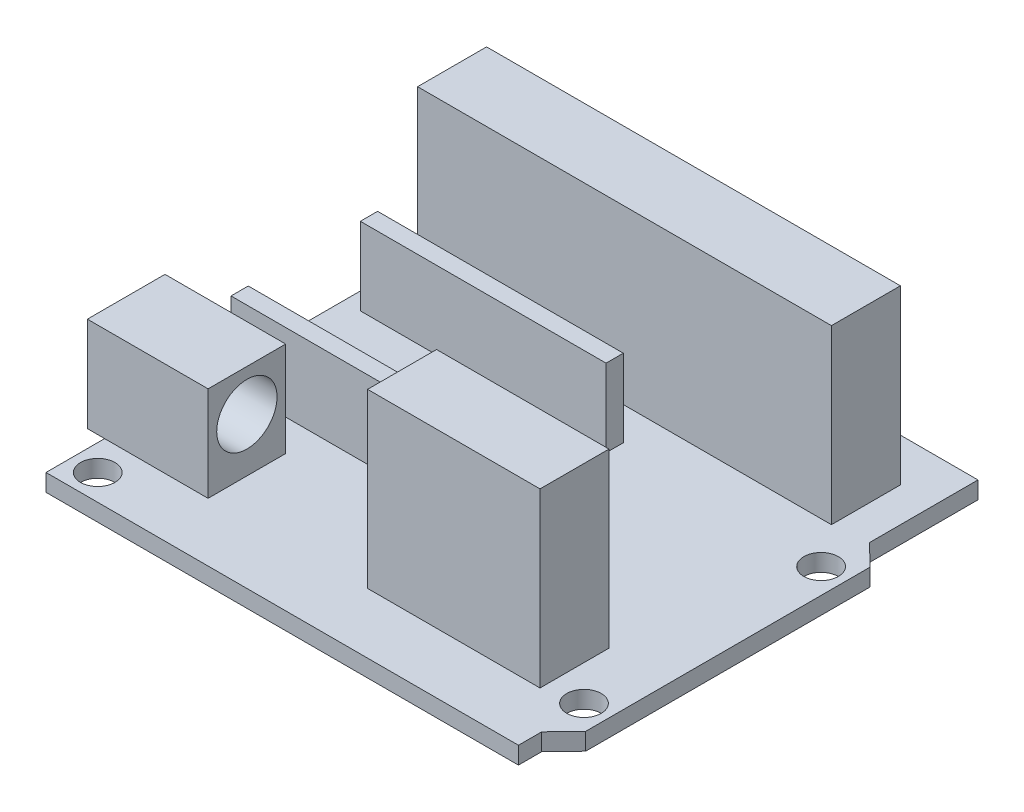
ISO-10303-21;
HEADER;
FILE_DESCRIPTION(('STEP AP214'),'2;1');
FILE_NAME('part.step','',(''),(''),'','','');
FILE_SCHEMA(('AUTOMOTIVE_DESIGN { 1 0 10303 214 1 1 1 1 }'));
ENDSEC;
DATA;
#1=APPLICATION_CONTEXT('core data for automotive mechanical design processes');
#2=APPLICATION_PROTOCOL_DEFINITION('international standard','automotive_design',2000,#1);
#3=PRODUCT_CONTEXT('',#1,'mechanical');
#4=PRODUCT('Part','Part','',(#3));
#5=PRODUCT_RELATED_PRODUCT_CATEGORY('part','',(#4));
#6=PRODUCT_DEFINITION_FORMATION('','',#4);
#7=PRODUCT_DEFINITION_CONTEXT('part definition',#1,'design');
#8=PRODUCT_DEFINITION('design','',#6,#7);
#9=PRODUCT_DEFINITION_SHAPE('','',#8);
#10=(LENGTH_UNIT() NAMED_UNIT(*) SI_UNIT(.MILLI.,.METRE.));
#11=(NAMED_UNIT(*) PLANE_ANGLE_UNIT() SI_UNIT($,.RADIAN.));
#12=(NAMED_UNIT(*) SI_UNIT($,.STERADIAN.) SOLID_ANGLE_UNIT());
#13=UNCERTAINTY_MEASURE_WITH_UNIT(LENGTH_MEASURE(1.E-05),#10,'distance_accuracy_value','');
#14=(GEOMETRIC_REPRESENTATION_CONTEXT(3) GLOBAL_UNCERTAINTY_ASSIGNED_CONTEXT((#13)) GLOBAL_UNIT_ASSIGNED_CONTEXT((#10,
#11,#12)) REPRESENTATION_CONTEXT('',''));
#15=CARTESIAN_POINT('',(0.,0.,0.));
#16=DIRECTION('',(0.,0.,1.));
#17=DIRECTION('',(1.,0.,0.));
#18=AXIS2_PLACEMENT_3D('',#15,#16,#17);
#19=CARTESIAN_POINT('',(0.,2.,0.));
#20=DIRECTION('',(0.,1.,0.));
#21=DIRECTION('',(0.,0.,1.));
#22=AXIS2_PLACEMENT_3D('',#19,#20,#21);
#23=PLANE('',#22);
#24=DIRECTION('',(-1.,0.,0.));
#25=VECTOR('',#24,1.);
#26=CARTESIAN_POINT('',(12.,2.,-6.8));
#27=LINE('',#26,#25);
#28=CARTESIAN_POINT('',(12.,2.,-6.8));
#29=VERTEX_POINT('',#28);
#30=CARTESIAN_POINT('',(0.,2.,-6.8));
#31=VERTEX_POINT('',#30);
#32=EDGE_CURVE('E251',#29,#31,#27,.T.);
#33=ORIENTED_EDGE('',*,*,#32,.T.);
#34=DIRECTION('',(0.,0.,-1.));
#35=VECTOR('',#34,1.);
#36=CARTESIAN_POINT('',(0.,2.,0.));
#37=LINE('',#36,#35);
#38=CARTESIAN_POINT('',(0.,2.,0.));
#39=VERTEX_POINT('',#38);
#40=EDGE_CURVE('E415',#39,#31,#37,.T.);
#41=ORIENTED_EDGE('',*,*,#40,.F.);
#42=DIRECTION('',(1.,0.,0.));
#43=VECTOR('',#42,1.);
#44=CARTESIAN_POINT('',(0.,2.,0.));
#45=LINE('',#44,#43);
#46=CARTESIAN_POINT('',(54.8,2.,0.));
#47=VERTEX_POINT('',#46);
#48=EDGE_CURVE('E418',#39,#47,#45,.T.);
#49=ORIENTED_EDGE('',*,*,#48,.T.);
#50=DIRECTION('',(0.,0.,-1.));
#51=VECTOR('',#50,1.);
#52=CARTESIAN_POINT('',(54.8,2.,2.8210303747817E-13));
#53=LINE('',#52,#51);
#54=CARTESIAN_POINT('',(54.8,2.,-2.69583333333333));
#55=VERTEX_POINT('',#54);
#56=EDGE_CURVE('E422',#47,#55,#53,.T.);
#57=ORIENTED_EDGE('',*,*,#56,.T.);
#58=DIRECTION('',(0.692531828189704,0.,-0.72138732103096));
#59=VECTOR('',#58,1.);
#60=CARTESIAN_POINT('',(27.171107410492,2.,26.0842631140716));
#61=LINE('',#60,#59);
#62=CARTESIAN_POINT('',(57.3,2.,-5.30000000000005));
#63=VERTEX_POINT('',#62);
#64=EDGE_CURVE('E425',#55,#63,#61,.T.);
#65=ORIENTED_EDGE('',*,*,#64,.T.);
#66=DIRECTION('',(0.,0.,1.));
#67=VECTOR('',#66,1.);
#68=CARTESIAN_POINT('',(57.3,2.,0.));
#69=LINE('',#68,#67);
#70=CARTESIAN_POINT('',(57.3,2.,-38.3));
#71=VERTEX_POINT('',#70);
#72=EDGE_CURVE('E402',#71,#63,#69,.T.);
#73=ORIENTED_EDGE('',*,*,#72,.F.);
#74=DIRECTION('',(0.72138732103096,0.,0.692531828189705));
#75=VECTOR('',#74,1.);
#76=CARTESIAN_POINT('',(46.6151540383007,2.,-48.5574521232311));
#77=LINE('',#76,#75);
#78=CARTESIAN_POINT('',(54.8,2.,-40.7));
#79=VERTEX_POINT('',#78);
#80=EDGE_CURVE('E405',#79,#71,#77,.T.);
#81=ORIENTED_EDGE('',*,*,#80,.F.);
#82=DIRECTION('',(0.,0.,1.));
#83=VECTOR('',#82,1.);
#84=CARTESIAN_POINT('',(54.8,2.,0.));
#85=LINE('',#84,#83);
#86=CARTESIAN_POINT('',(54.8,2.,-53.3));
#87=VERTEX_POINT('',#86);
#88=EDGE_CURVE('E408',#87,#79,#85,.T.);
#89=ORIENTED_EDGE('',*,*,#88,.F.);
#90=DIRECTION('',(1.,0.,0.));
#91=VECTOR('',#90,1.);
#92=CARTESIAN_POINT('',(0.,2.,-53.3));
#93=LINE('',#92,#91);
#94=CARTESIAN_POINT('',(0.,2.,-53.3));
#95=VERTEX_POINT('',#94);
#96=EDGE_CURVE('E411',#95,#87,#93,.T.);
#97=ORIENTED_EDGE('',*,*,#96,.F.);
#98=CARTESIAN_POINT('',(0.,2.,-15.8));
#99=VERTEX_POINT('',#98);
#100=EDGE_CURVE('E414',#99,#95,#37,.T.);
#101=ORIENTED_EDGE('',*,*,#100,.F.);
#102=DIRECTION('',(-1.,0.,0.));
#103=VECTOR('',#102,1.);
#104=CARTESIAN_POINT('',(12.,2.,-15.8));
#105=LINE('',#104,#103);
#106=CARTESIAN_POINT('',(12.,2.,-15.8));
#107=VERTEX_POINT('',#106);
#108=EDGE_CURVE('E50',#107,#99,#105,.T.);
#109=ORIENTED_EDGE('',*,*,#108,.F.);
#110=DIRECTION('',(0.,0.,1.));
#111=VECTOR('',#110,1.);
#112=CARTESIAN_POINT('',(12.,2.,-6.8));
#113=LINE('',#112,#111);
#114=EDGE_CURVE('E237',#107,#29,#113,.T.);
#115=ORIENTED_EDGE('',*,*,#114,.T.);
#116=EDGE_LOOP('',(#33,#41,#49,#57,#65,#73,#81,#89,#97,#101,#109,#115));
#117=FACE_BOUND('',#116,.T.);
#118=CARTESIAN_POINT('',(54.4,2.,-35.5));
#119=DIRECTION('',(0.,1.,0.));
#120=DIRECTION('',(0.,0.,1.));
#121=AXIS2_PLACEMENT_3D('',#118,#119,#120);
#122=CIRCLE('',#121,2.);
#123=CARTESIAN_POINT('',(54.4,2.,-33.5));
#124=VERTEX_POINT('',#123);
#125=EDGE_CURVE('E389',#124,#124,#122,.T.);
#126=ORIENTED_EDGE('',*,*,#125,.F.);
#127=EDGE_LOOP('',(#126));
#128=FACE_BOUND('',#127,.T.);
#129=CARTESIAN_POINT('',(54.4,2.,-8.));
#130=DIRECTION('',(0.,1.,0.));
#131=DIRECTION('',(0.,0.,1.));
#132=AXIS2_PLACEMENT_3D('',#129,#130,#131);
#133=CIRCLE('',#132,2.);
#134=CARTESIAN_POINT('',(54.4,2.,-6.));
#135=VERTEX_POINT('',#134);
#136=EDGE_CURVE('E392',#135,#135,#133,.T.);
#137=ORIENTED_EDGE('',*,*,#136,.F.);
#138=EDGE_LOOP('',(#137));
#139=FACE_BOUND('',#138,.T.);
#140=CARTESIAN_POINT('',(4.,2.,-50.8));
#141=DIRECTION('',(0.,1.,0.));
#142=DIRECTION('',(0.,0.,1.));
#143=AXIS2_PLACEMENT_3D('',#140,#141,#142);
#144=CIRCLE('',#143,2.);
#145=CARTESIAN_POINT('',(4.,2.,-48.8));
#146=VERTEX_POINT('',#145);
#147=EDGE_CURVE('E396',#146,#146,#144,.T.);
#148=ORIENTED_EDGE('',*,*,#147,.F.);
#149=EDGE_LOOP('',(#148));
#150=FACE_BOUND('',#149,.T.);
#151=CARTESIAN_POINT('',(3.,2.,-3.));
#152=DIRECTION('',(0.,1.,0.));
#153=DIRECTION('',(0.,0.,1.));
#154=AXIS2_PLACEMENT_3D('',#151,#152,#153);
#155=CIRCLE('',#154,2.);
#156=CARTESIAN_POINT('',(3.,2.,-1.));
#157=VERTEX_POINT('',#156);
#158=EDGE_CURVE('E399',#157,#157,#155,.T.);
#159=ORIENTED_EDGE('',*,*,#158,.F.);
#160=EDGE_LOOP('',(#159));
#161=FACE_BOUND('',#160,.T.);
#162=DIRECTION('',(1.,0.,0.));
#163=VECTOR('',#162,1.);
#164=CARTESIAN_POINT('',(2.,2.,-34.4601858981801));
#165=LINE('',#164,#163);
#166=CARTESIAN_POINT('',(2.,2.,-34.4601858981801));
#167=VERTEX_POINT('',#166);
#168=CARTESIAN_POINT('',(30.5,2.,-34.4601858981801));
#169=VERTEX_POINT('',#168);
#170=EDGE_CURVE('E373',#167,#169,#165,.T.);
#171=ORIENTED_EDGE('',*,*,#170,.F.);
#172=DIRECTION('',(0.,0.,1.));
#173=VECTOR('',#172,1.);
#174=CARTESIAN_POINT('',(2.,2.,-36.4601858981801));
#175=LINE('',#174,#173);
#176=CARTESIAN_POINT('',(2.,2.,-36.4601858981801));
#177=VERTEX_POINT('',#176);
#178=EDGE_CURVE('E359',#177,#167,#175,.T.);
#179=ORIENTED_EDGE('',*,*,#178,.F.);
#180=DIRECTION('',(-1.,0.,0.));
#181=VECTOR('',#180,1.);
#182=CARTESIAN_POINT('',(2.,2.,-36.4601858981801));
#183=LINE('',#182,#181);
#184=CARTESIAN_POINT('',(30.5,2.,-36.4601858981801));
#185=VERTEX_POINT('',#184);
#186=EDGE_CURVE('E364',#185,#177,#183,.T.);
#187=ORIENTED_EDGE('',*,*,#186,.F.);
#188=DIRECTION('',(0.,0.,-1.));
#189=VECTOR('',#188,1.);
#190=CARTESIAN_POINT('',(30.5,2.,-36.4601858981801));
#191=LINE('',#190,#189);
#192=EDGE_CURVE('E375',#169,#185,#191,.T.);
#193=ORIENTED_EDGE('',*,*,#192,.F.);
#194=EDGE_LOOP('',(#171,#179,#187,#193));
#195=FACE_BOUND('',#194,.T.);
#196=DIRECTION('',(1.,0.,0.));
#197=VECTOR('',#196,1.);
#198=CARTESIAN_POINT('',(2.,2.,-19.4601858981801));
#199=LINE('',#198,#197);
#200=CARTESIAN_POINT('',(2.,2.,-19.4601858981801));
#201=VERTEX_POINT('',#200);
#202=CARTESIAN_POINT('',(30.5,2.,-19.4601858981801));
#203=VERTEX_POINT('',#202);
#204=EDGE_CURVE('E344',#201,#203,#199,.T.);
#205=ORIENTED_EDGE('',*,*,#204,.F.);
#206=DIRECTION('',(0.,0.,1.));
#207=VECTOR('',#206,1.);
#208=CARTESIAN_POINT('',(2.,2.,-21.4601858981801));
#209=LINE('',#208,#207);
#210=CARTESIAN_POINT('',(2.,2.,-21.4601858981801));
#211=VERTEX_POINT('',#210);
#212=EDGE_CURVE('E330',#211,#201,#209,.T.);
#213=ORIENTED_EDGE('',*,*,#212,.F.);
#214=DIRECTION('',(-1.,0.,0.));
#215=VECTOR('',#214,1.);
#216=CARTESIAN_POINT('',(2.,2.,-21.4601858981801));
#217=LINE('',#216,#215);
#218=CARTESIAN_POINT('',(30.5,2.,-21.4601858981801));
#219=VERTEX_POINT('',#218);
#220=EDGE_CURVE('E335',#219,#211,#217,.T.);
#221=ORIENTED_EDGE('',*,*,#220,.F.);
#222=DIRECTION('',(0.,0.,-1.));
#223=VECTOR('',#222,1.);
#224=CARTESIAN_POINT('',(30.5,2.,-21.4601858981801));
#225=LINE('',#224,#223);
#226=EDGE_CURVE('E346',#203,#219,#225,.T.);
#227=ORIENTED_EDGE('',*,*,#226,.F.);
#228=EDGE_LOOP('',(#205,#213,#221,#227));
#229=FACE_BOUND('',#228,.T.);
#230=DIRECTION('',(-1.,0.,0.));
#231=VECTOR('',#230,1.);
#232=CARTESIAN_POINT('',(50.3,2.,-15.));
#233=LINE('',#232,#231);
#234=CARTESIAN_POINT('',(50.3,2.,-15.));
#235=VERTEX_POINT('',#234);
#236=CARTESIAN_POINT('',(30.3,2.,-15.));
#237=VERTEX_POINT('',#236);
#238=EDGE_CURVE('E315',#235,#237,#233,.T.);
#239=ORIENTED_EDGE('',*,*,#238,.F.);
#240=DIRECTION('',(0.,0.,-1.));
#241=VECTOR('',#240,1.);
#242=CARTESIAN_POINT('',(50.3,2.,-7.));
#243=LINE('',#242,#241);
#244=CARTESIAN_POINT('',(50.3,2.,-7.));
#245=VERTEX_POINT('',#244);
#246=EDGE_CURVE('E301',#245,#235,#243,.T.);
#247=ORIENTED_EDGE('',*,*,#246,.F.);
#248=DIRECTION('',(1.,0.,0.));
#249=VECTOR('',#248,1.);
#250=CARTESIAN_POINT('',(50.3,2.,-7.));
#251=LINE('',#250,#249);
#252=CARTESIAN_POINT('',(30.3,2.,-7.));
#253=VERTEX_POINT('',#252);
#254=EDGE_CURVE('E306',#253,#245,#251,.T.);
#255=ORIENTED_EDGE('',*,*,#254,.F.);
#256=DIRECTION('',(0.,0.,1.));
#257=VECTOR('',#256,1.);
#258=CARTESIAN_POINT('',(30.3,2.,-7.));
#259=LINE('',#258,#257);
#260=EDGE_CURVE('E317',#237,#253,#259,.T.);
#261=ORIENTED_EDGE('',*,*,#260,.F.);
#262=EDGE_LOOP('',(#239,#247,#255,#261));
#263=FACE_BOUND('',#262,.T.);
#264=DIRECTION('',(-1.,0.,0.));
#265=VECTOR('',#264,1.);
#266=CARTESIAN_POINT('',(50.8,2.,-48.3));
#267=LINE('',#266,#265);
#268=CARTESIAN_POINT('',(50.8,2.,-48.3));
#269=VERTEX_POINT('',#268);
#270=CARTESIAN_POINT('',(2.8,2.,-48.3));
#271=VERTEX_POINT('',#270);
#272=EDGE_CURVE('E288',#269,#271,#267,.T.);
#273=ORIENTED_EDGE('',*,*,#272,.F.);
#274=DIRECTION('',(0.,0.,-1.));
#275=VECTOR('',#274,1.);
#276=CARTESIAN_POINT('',(50.8,2.,-48.3));
#277=LINE('',#276,#275);
#278=CARTESIAN_POINT('',(50.8,2.,-40.3));
#279=VERTEX_POINT('',#278);
#280=EDGE_CURVE('E270',#279,#269,#277,.T.);
#281=ORIENTED_EDGE('',*,*,#280,.F.);
#282=DIRECTION('',(1.,0.,0.));
#283=VECTOR('',#282,1.);
#284=CARTESIAN_POINT('',(50.8,2.,-40.3));
#285=LINE('',#284,#283);
#286=CARTESIAN_POINT('',(2.8,2.,-40.3));
#287=VERTEX_POINT('',#286);
#288=EDGE_CURVE('E279',#287,#279,#285,.T.);
#289=ORIENTED_EDGE('',*,*,#288,.F.);
#290=DIRECTION('',(0.,0.,1.));
#291=VECTOR('',#290,1.);
#292=CARTESIAN_POINT('',(2.8,2.,-48.3));
#293=LINE('',#292,#291);
#294=EDGE_CURVE('E290',#271,#287,#293,.T.);
#295=ORIENTED_EDGE('',*,*,#294,.F.);
#296=EDGE_LOOP('',(#273,#281,#289,#295));
#297=FACE_BOUND('',#296,.T.);
#298=ADVANCED_FACE('F35',(#117,#128,#139,#150,#161,#195,#229,#263,#297),#23,.T.);
#299=CARTESIAN_POINT('',(57.3,2.,0.));
#300=DIRECTION('',(1.,0.,0.));
#301=DIRECTION('',(0.,0.,-1.));
#302=AXIS2_PLACEMENT_3D('',#299,#300,#301);
#303=PLANE('',#302);
#304=DIRECTION('',(0.,0.,1.));
#305=VECTOR('',#304,1.);
#306=CARTESIAN_POINT('',(57.3,0.,0.));
#307=LINE('',#306,#305);
#308=CARTESIAN_POINT('',(57.3,0.,-38.3));
#309=VERTEX_POINT('',#308);
#310=CARTESIAN_POINT('',(57.3,0.,-5.30000000000005));
#311=VERTEX_POINT('',#310);
#312=EDGE_CURVE('E439',#309,#311,#307,.T.);
#313=ORIENTED_EDGE('',*,*,#312,.F.);
#314=DIRECTION('',(0.,-1.,0.));
#315=VECTOR('',#314,1.);
#316=CARTESIAN_POINT('',(57.3,2.,-38.3));
#317=LINE('',#316,#315);
#318=EDGE_CURVE('E11',#71,#309,#317,.T.);
#319=ORIENTED_EDGE('',*,*,#318,.F.);
#320=ORIENTED_EDGE('',*,*,#72,.T.);
#321=DIRECTION('',(0.,-1.,0.));
#322=VECTOR('',#321,1.);
#323=CARTESIAN_POINT('',(57.3,2.,-5.30000000000005));
#324=LINE('',#323,#322);
#325=EDGE_CURVE('E427',#63,#311,#324,.T.);
#326=ORIENTED_EDGE('',*,*,#325,.T.);
#327=EDGE_LOOP('',(#313,#319,#320,#326));
#328=FACE_BOUND('',#327,.T.);
#329=ADVANCED_FACE('F498',(#328),#303,.T.);
#330=CARTESIAN_POINT('',(46.6151540383007,2.,-48.5574521232311));
#331=DIRECTION('',(0.692531828189705,0.,-0.72138732103096));
#332=DIRECTION('',(-0.72138732103096,0.,-0.692531828189705));
#333=AXIS2_PLACEMENT_3D('',#330,#331,#332);
#334=PLANE('',#333);
#335=DIRECTION('',(0.72138732103096,0.,0.692531828189705));
#336=VECTOR('',#335,1.);
#337=CARTESIAN_POINT('',(46.6151540383007,0.,-48.5574521232311));
#338=LINE('',#337,#336);
#339=CARTESIAN_POINT('',(54.8,0.,-40.7));
#340=VERTEX_POINT('',#339);
#341=EDGE_CURVE('E442',#340,#309,#338,.T.);
#342=ORIENTED_EDGE('',*,*,#341,.F.);
#343=DIRECTION('',(0.,-1.,0.));
#344=VECTOR('',#343,1.);
#345=CARTESIAN_POINT('',(54.8,2.,-40.7));
#346=LINE('',#345,#344);
#347=EDGE_CURVE('E43',#79,#340,#346,.T.);
#348=ORIENTED_EDGE('',*,*,#347,.F.);
#349=ORIENTED_EDGE('',*,*,#80,.T.);
#350=ORIENTED_EDGE('',*,*,#318,.T.);
#351=EDGE_LOOP('',(#342,#348,#349,#350));
#352=FACE_BOUND('',#351,.T.);
#353=ADVANCED_FACE('F481',(#352),#334,.T.);
#354=CARTESIAN_POINT('',(54.8,2.,0.));
#355=DIRECTION('',(1.,0.,0.));
#356=DIRECTION('',(0.,0.,-1.));
#357=AXIS2_PLACEMENT_3D('',#354,#355,#356);
#358=PLANE('',#357);
#359=DIRECTION('',(0.,0.,1.));
#360=VECTOR('',#359,1.);
#361=CARTESIAN_POINT('',(54.8,0.,0.));
#362=LINE('',#361,#360);
#363=CARTESIAN_POINT('',(54.8,0.,-53.3));
#364=VERTEX_POINT('',#363);
#365=EDGE_CURVE('E445',#364,#340,#362,.T.);
#366=ORIENTED_EDGE('',*,*,#365,.F.);
#367=DIRECTION('',(0.,-1.,0.));
#368=VECTOR('',#367,1.);
#369=CARTESIAN_POINT('',(54.8,2.,-53.3));
#370=LINE('',#369,#368);
#371=EDGE_CURVE('E473',#87,#364,#370,.T.);
#372=ORIENTED_EDGE('',*,*,#371,.F.);
#373=ORIENTED_EDGE('',*,*,#88,.T.);
#374=ORIENTED_EDGE('',*,*,#347,.T.);
#375=EDGE_LOOP('',(#366,#372,#373,#374));
#376=FACE_BOUND('',#375,.T.);
#377=ADVANCED_FACE('F477',(#376),#358,.T.);
#378=CARTESIAN_POINT('',(0.,2.,-53.3));
#379=DIRECTION('',(0.,0.,-1.));
#380=DIRECTION('',(-1.,0.,0.));
#381=AXIS2_PLACEMENT_3D('',#378,#379,#380);
#382=PLANE('',#381);
#383=DIRECTION('',(1.,0.,0.));
#384=VECTOR('',#383,1.);
#385=CARTESIAN_POINT('',(0.,0.,-53.3));
#386=LINE('',#385,#384);
#387=CARTESIAN_POINT('',(0.,0.,-53.3));
#388=VERTEX_POINT('',#387);
#389=EDGE_CURVE('E448',#388,#364,#386,.T.);
#390=ORIENTED_EDGE('',*,*,#389,.F.);
#391=DIRECTION('',(0.,-1.,0.));
#392=VECTOR('',#391,1.);
#393=CARTESIAN_POINT('',(0.,2.,-53.3));
#394=LINE('',#393,#392);
#395=EDGE_CURVE('E471',#95,#388,#394,.T.);
#396=ORIENTED_EDGE('',*,*,#395,.F.);
#397=ORIENTED_EDGE('',*,*,#96,.T.);
#398=ORIENTED_EDGE('',*,*,#371,.T.);
#399=EDGE_LOOP('',(#390,#396,#397,#398));
#400=FACE_BOUND('',#399,.T.);
#401=ADVANCED_FACE('F490',(#400),#382,.T.);
#402=CARTESIAN_POINT('',(0.,2.,0.));
#403=DIRECTION('',(-1.,0.,0.));
#404=DIRECTION('',(0.,0.,1.));
#405=AXIS2_PLACEMENT_3D('',#402,#403,#404);
#406=PLANE('',#405);
#407=DIRECTION('',(0.,0.,-1.));
#408=VECTOR('',#407,1.);
#409=CARTESIAN_POINT('',(0.,0.,0.));
#410=LINE('',#409,#408);
#411=CARTESIAN_POINT('',(0.,0.,0.));
#412=VERTEX_POINT('',#411);
#413=EDGE_CURVE('E451',#412,#388,#410,.T.);
#414=ORIENTED_EDGE('',*,*,#413,.F.);
#415=DIRECTION('',(0.,-1.,0.));
#416=VECTOR('',#415,1.);
#417=CARTESIAN_POINT('',(0.,2.,0.));
#418=LINE('',#417,#416);
#419=EDGE_CURVE('E469',#39,#412,#418,.T.);
#420=ORIENTED_EDGE('',*,*,#419,.F.);
#421=ORIENTED_EDGE('',*,*,#40,.T.);
#422=EDGE_CURVE('E419',#31,#99,#37,.T.);
#423=ORIENTED_EDGE('',*,*,#422,.T.);
#424=ORIENTED_EDGE('',*,*,#100,.T.);
#425=ORIENTED_EDGE('',*,*,#395,.T.);
#426=EDGE_LOOP('',(#414,#420,#421,#423,#424,#425));
#427=FACE_BOUND('',#426,.T.);
#428=ADVANCED_FACE('F509',(#427),#406,.T.);
#429=CARTESIAN_POINT('',(0.,2.,0.));
#430=DIRECTION('',(0.,0.,-1.));
#431=DIRECTION('',(-1.,0.,0.));
#432=AXIS2_PLACEMENT_3D('',#429,#430,#431);
#433=PLANE('',#432);
#434=DIRECTION('',(1.,0.,0.));
#435=VECTOR('',#434,1.);
#436=CARTESIAN_POINT('',(0.,0.,0.));
#437=LINE('',#436,#435);
#438=CARTESIAN_POINT('',(54.8,0.,0.));
#439=VERTEX_POINT('',#438);
#440=EDGE_CURVE('E454',#412,#439,#437,.T.);
#441=ORIENTED_EDGE('',*,*,#440,.T.);
#442=DIRECTION('',(0.,-1.,0.));
#443=VECTOR('',#442,1.);
#444=CARTESIAN_POINT('',(54.8,2.,0.));
#445=LINE('',#444,#443);
#446=EDGE_CURVE('E466',#47,#439,#445,.T.);
#447=ORIENTED_EDGE('',*,*,#446,.F.);
#448=ORIENTED_EDGE('',*,*,#48,.F.);
#449=ORIENTED_EDGE('',*,*,#419,.T.);
#450=EDGE_LOOP('',(#441,#447,#448,#449));
#451=FACE_BOUND('',#450,.T.);
#452=ADVANCED_FACE('F507',(#451),#433,.F.);
#453=CARTESIAN_POINT('',(54.8,2.,2.8210303747817E-13));
#454=DIRECTION('',(-1.,0.,0.));
#455=DIRECTION('',(0.,0.,1.));
#456=AXIS2_PLACEMENT_3D('',#453,#454,#455);
#457=PLANE('',#456);
#458=DIRECTION('',(0.,0.,-1.));
#459=VECTOR('',#458,1.);
#460=CARTESIAN_POINT('',(54.8,0.,2.8210303747817E-13));
#461=LINE('',#460,#459);
#462=CARTESIAN_POINT('',(54.8,0.,-2.69583333333333));
#463=VERTEX_POINT('',#462);
#464=EDGE_CURVE('E457',#439,#463,#461,.T.);
#465=ORIENTED_EDGE('',*,*,#464,.T.);
#466=DIRECTION('',(0.,-1.,0.));
#467=VECTOR('',#466,1.);
#468=CARTESIAN_POINT('',(54.8,2.,-2.69583333333333));
#469=LINE('',#468,#467);
#470=EDGE_CURVE('E463',#55,#463,#469,.T.);
#471=ORIENTED_EDGE('',*,*,#470,.F.);
#472=ORIENTED_EDGE('',*,*,#56,.F.);
#473=ORIENTED_EDGE('',*,*,#446,.T.);
#474=EDGE_LOOP('',(#465,#471,#472,#473));
#475=FACE_BOUND('',#474,.T.);
#476=ADVANCED_FACE('F503',(#475),#457,.F.);
#477=CARTESIAN_POINT('',(3.,2.,-3.));
#478=DIRECTION('',(0.,-1.,0.));
#479=DIRECTION('',(0.,0.,-1.));
#480=AXIS2_PLACEMENT_3D('',#477,#478,#479);
#481=CYLINDRICAL_SURFACE('',#480,2.);
#482=ORIENTED_EDGE('',*,*,#158,.T.);
#483=EDGE_LOOP('',(#482));
#484=FACE_BOUND('',#483,.T.);
#485=CARTESIAN_POINT('',(3.,0.,-3.));
#486=DIRECTION('',(0.,1.,0.));
#487=DIRECTION('',(0.,0.,1.));
#488=AXIS2_PLACEMENT_3D('',#485,#486,#487);
#489=CIRCLE('',#488,2.);
#490=CARTESIAN_POINT('',(3.,0.,-1.));
#491=VERTEX_POINT('',#490);
#492=EDGE_CURVE('E436',#491,#491,#489,.T.);
#493=ORIENTED_EDGE('',*,*,#492,.F.);
#494=EDGE_LOOP('',(#493));
#495=FACE_BOUND('',#494,.T.);
#496=ADVANCED_FACE('F544',(#484,#495),#481,.F.);
#497=CARTESIAN_POINT('',(4.,2.,-50.8));
#498=DIRECTION('',(0.,-1.,0.));
#499=DIRECTION('',(0.,0.,-1.));
#500=AXIS2_PLACEMENT_3D('',#497,#498,#499);
#501=CYLINDRICAL_SURFACE('',#500,2.);
#502=ORIENTED_EDGE('',*,*,#147,.T.);
#503=EDGE_LOOP('',(#502));
#504=FACE_BOUND('',#503,.T.);
#505=CARTESIAN_POINT('',(4.,0.,-50.8));
#506=DIRECTION('',(0.,1.,0.));
#507=DIRECTION('',(0.,0.,1.));
#508=AXIS2_PLACEMENT_3D('',#505,#506,#507);
#509=CIRCLE('',#508,2.);
#510=CARTESIAN_POINT('',(4.,0.,-48.8));
#511=VERTEX_POINT('',#510);
#512=EDGE_CURVE('E433',#511,#511,#509,.T.);
#513=ORIENTED_EDGE('',*,*,#512,.F.);
#514=EDGE_LOOP('',(#513));
#515=FACE_BOUND('',#514,.T.);
#516=ADVANCED_FACE('F557',(#504,#515),#501,.F.);
#517=CARTESIAN_POINT('',(54.4,2.,-8.));
#518=DIRECTION('',(0.,-1.,0.));
#519=DIRECTION('',(0.,0.,-1.));
#520=AXIS2_PLACEMENT_3D('',#517,#518,#519);
#521=CYLINDRICAL_SURFACE('',#520,2.);
#522=ORIENTED_EDGE('',*,*,#136,.T.);
#523=EDGE_LOOP('',(#522));
#524=FACE_BOUND('',#523,.T.);
#525=CARTESIAN_POINT('',(54.4,0.,-8.));
#526=DIRECTION('',(0.,1.,0.));
#527=DIRECTION('',(0.,0.,1.));
#528=AXIS2_PLACEMENT_3D('',#525,#526,#527);
#529=CIRCLE('',#528,2.);
#530=CARTESIAN_POINT('',(54.4,0.,-6.));
#531=VERTEX_POINT('',#530);
#532=EDGE_CURVE('E430',#531,#531,#529,.T.);
#533=ORIENTED_EDGE('',*,*,#532,.F.);
#534=EDGE_LOOP('',(#533));
#535=FACE_BOUND('',#534,.T.);
#536=ADVANCED_FACE('F560',(#524,#535),#521,.F.);
#537=CARTESIAN_POINT('',(54.4,2.,-35.5));
#538=DIRECTION('',(0.,-1.,0.));
#539=DIRECTION('',(0.,0.,-1.));
#540=AXIS2_PLACEMENT_3D('',#537,#538,#539);
#541=CYLINDRICAL_SURFACE('',#540,2.);
#542=ORIENTED_EDGE('',*,*,#125,.T.);
#543=EDGE_LOOP('',(#542));
#544=FACE_BOUND('',#543,.T.);
#545=CARTESIAN_POINT('',(54.4,0.,-35.5));
#546=DIRECTION('',(0.,1.,0.));
#547=DIRECTION('',(0.,0.,1.));
#548=AXIS2_PLACEMENT_3D('',#545,#546,#547);
#549=CIRCLE('',#548,2.);
#550=CARTESIAN_POINT('',(54.4,0.,-33.5));
#551=VERTEX_POINT('',#550);
#552=EDGE_CURVE('E388',#551,#551,#549,.T.);
#553=ORIENTED_EDGE('',*,*,#552,.F.);
#554=EDGE_LOOP('',(#553));
#555=FACE_BOUND('',#554,.T.);
#556=ADVANCED_FACE('F37',(#544,#555),#541,.F.);
#557=CARTESIAN_POINT('',(27.171107410492,2.,26.0842631140716));
#558=DIRECTION('',(-0.72138732103096,0.,-0.692531828189704));
#559=DIRECTION('',(-0.692531828189704,0.,0.72138732103096));
#560=AXIS2_PLACEMENT_3D('',#557,#558,#559);
#561=PLANE('',#560);
#562=DIRECTION('',(0.692531828189704,0.,-0.72138732103096));
#563=VECTOR('',#562,1.);
#564=CARTESIAN_POINT('',(27.171107410492,0.,26.0842631140716));
#565=LINE('',#564,#563);
#566=EDGE_CURVE('E393',#463,#311,#565,.T.);
#567=ORIENTED_EDGE('',*,*,#566,.T.);
#568=ORIENTED_EDGE('',*,*,#325,.F.);
#569=ORIENTED_EDGE('',*,*,#64,.F.);
#570=ORIENTED_EDGE('',*,*,#470,.T.);
#571=EDGE_LOOP('',(#567,#568,#569,#570));
#572=FACE_BOUND('',#571,.T.);
#573=ADVANCED_FACE('F501',(#572),#561,.F.);
#574=CARTESIAN_POINT('',(0.,0.,0.));
#575=DIRECTION('',(0.,1.,0.));
#576=DIRECTION('',(0.,0.,1.));
#577=AXIS2_PLACEMENT_3D('',#574,#575,#576);
#578=PLANE('',#577);
#579=ORIENTED_EDGE('',*,*,#552,.T.);
#580=EDGE_LOOP('',(#579));
#581=FACE_BOUND('',#580,.T.);
#582=ORIENTED_EDGE('',*,*,#532,.T.);
#583=EDGE_LOOP('',(#582));
#584=FACE_BOUND('',#583,.T.);
#585=ORIENTED_EDGE('',*,*,#512,.T.);
#586=EDGE_LOOP('',(#585));
#587=FACE_BOUND('',#586,.T.);
#588=ORIENTED_EDGE('',*,*,#492,.T.);
#589=EDGE_LOOP('',(#588));
#590=FACE_BOUND('',#589,.T.);
#591=ORIENTED_EDGE('',*,*,#312,.T.);
#592=ORIENTED_EDGE('',*,*,#566,.F.);
#593=ORIENTED_EDGE('',*,*,#464,.F.);
#594=ORIENTED_EDGE('',*,*,#440,.F.);
#595=ORIENTED_EDGE('',*,*,#413,.T.);
#596=ORIENTED_EDGE('',*,*,#389,.T.);
#597=ORIENTED_EDGE('',*,*,#365,.T.);
#598=ORIENTED_EDGE('',*,*,#341,.T.);
#599=EDGE_LOOP('',(#591,#592,#593,#594,#595,#596,#597,#598));
#600=FACE_BOUND('',#599,.T.);
#601=ADVANCED_FACE('F484',(#581,#584,#587,#590,#600),#578,.F.);
#602=CARTESIAN_POINT('',(2.,11.,-36.4601858981801));
#603=DIRECTION('',(1.,0.,0.));
#604=DIRECTION('',(0.,0.,-1.));
#605=AXIS2_PLACEMENT_3D('',#602,#603,#604);
#606=PLANE('',#605);
#607=ORIENTED_EDGE('',*,*,#178,.T.);
#608=DIRECTION('',(0.,-1.,0.));
#609=VECTOR('',#608,1.);
#610=CARTESIAN_POINT('',(2.,11.,-34.4601858981801));
#611=LINE('',#610,#609);
#612=CARTESIAN_POINT('',(2.,11.,-34.4601858981801));
#613=VERTEX_POINT('',#612);
#614=EDGE_CURVE('E386',#613,#167,#611,.T.);
#615=ORIENTED_EDGE('',*,*,#614,.F.);
#616=DIRECTION('',(0.,0.,1.));
#617=VECTOR('',#616,1.);
#618=CARTESIAN_POINT('',(2.,11.,-36.4601858981801));
#619=LINE('',#618,#617);
#620=CARTESIAN_POINT('',(2.,11.,-36.4601858981801));
#621=VERTEX_POINT('',#620);
#622=EDGE_CURVE('E360',#621,#613,#619,.T.);
#623=ORIENTED_EDGE('',*,*,#622,.F.);
#624=DIRECTION('',(0.,-1.,0.));
#625=VECTOR('',#624,1.);
#626=CARTESIAN_POINT('',(2.,11.,-36.4601858981801));
#627=LINE('',#626,#625);
#628=EDGE_CURVE('E370',#621,#177,#627,.T.);
#629=ORIENTED_EDGE('',*,*,#628,.T.);
#630=EDGE_LOOP('',(#607,#615,#623,#629));
#631=FACE_BOUND('',#630,.T.);
#632=ADVANCED_FACE('F535',(#631),#606,.F.);
#633=CARTESIAN_POINT('',(2.,11.,-34.4601858981801));
#634=DIRECTION('',(0.,0.,-1.));
#635=DIRECTION('',(-1.,0.,0.));
#636=AXIS2_PLACEMENT_3D('',#633,#634,#635);
#637=PLANE('',#636);
#638=ORIENTED_EDGE('',*,*,#170,.T.);
#639=DIRECTION('',(0.,-1.,0.));
#640=VECTOR('',#639,1.);
#641=CARTESIAN_POINT('',(30.5,11.,-34.4601858981801));
#642=LINE('',#641,#640);
#643=CARTESIAN_POINT('',(30.5,11.,-34.4601858981801));
#644=VERTEX_POINT('',#643);
#645=EDGE_CURVE('E383',#644,#169,#642,.T.);
#646=ORIENTED_EDGE('',*,*,#645,.F.);
#647=DIRECTION('',(1.,0.,0.));
#648=VECTOR('',#647,1.);
#649=CARTESIAN_POINT('',(2.,11.,-34.4601858981801));
#650=LINE('',#649,#648);
#651=EDGE_CURVE('E363',#613,#644,#650,.T.);
#652=ORIENTED_EDGE('',*,*,#651,.F.);
#653=ORIENTED_EDGE('',*,*,#614,.T.);
#654=EDGE_LOOP('',(#638,#646,#652,#653));
#655=FACE_BOUND('',#654,.T.);
#656=ADVANCED_FACE('F678',(#655),#637,.F.);
#657=CARTESIAN_POINT('',(30.5,11.,-36.4601858981801));
#658=DIRECTION('',(-1.,0.,0.));
#659=DIRECTION('',(0.,0.,1.));
#660=AXIS2_PLACEMENT_3D('',#657,#658,#659);
#661=PLANE('',#660);
#662=ORIENTED_EDGE('',*,*,#192,.T.);
#663=DIRECTION('',(0.,-1.,0.));
#664=VECTOR('',#663,1.);
#665=CARTESIAN_POINT('',(30.5,11.,-36.4601858981801));
#666=LINE('',#665,#664);
#667=CARTESIAN_POINT('',(30.5,11.,-36.4601858981801));
#668=VERTEX_POINT('',#667);
#669=EDGE_CURVE('E381',#668,#185,#666,.T.);
#670=ORIENTED_EDGE('',*,*,#669,.F.);
#671=DIRECTION('',(0.,0.,-1.));
#672=VECTOR('',#671,1.);
#673=CARTESIAN_POINT('',(30.5,11.,-36.4601858981801));
#674=LINE('',#673,#672);
#675=EDGE_CURVE('E366',#644,#668,#674,.T.);
#676=ORIENTED_EDGE('',*,*,#675,.F.);
#677=ORIENTED_EDGE('',*,*,#645,.T.);
#678=EDGE_LOOP('',(#662,#670,#676,#677));
#679=FACE_BOUND('',#678,.T.);
#680=ADVANCED_FACE('F675',(#679),#661,.F.);
#681=CARTESIAN_POINT('',(2.,11.,-36.4601858981801));
#682=DIRECTION('',(0.,0.,1.));
#683=DIRECTION('',(1.,0.,0.));
#684=AXIS2_PLACEMENT_3D('',#681,#682,#683);
#685=PLANE('',#684);
#686=ORIENTED_EDGE('',*,*,#186,.T.);
#687=ORIENTED_EDGE('',*,*,#628,.F.);
#688=DIRECTION('',(-1.,0.,0.));
#689=VECTOR('',#688,1.);
#690=CARTESIAN_POINT('',(2.,11.,-36.4601858981801));
#691=LINE('',#690,#689);
#692=EDGE_CURVE('E368',#668,#621,#691,.T.);
#693=ORIENTED_EDGE('',*,*,#692,.F.);
#694=ORIENTED_EDGE('',*,*,#669,.T.);
#695=EDGE_LOOP('',(#686,#687,#693,#694));
#696=FACE_BOUND('',#695,.T.);
#697=ADVANCED_FACE('F671',(#696),#685,.F.);
#698=CARTESIAN_POINT('',(0.,11.,0.));
#699=DIRECTION('',(0.,1.,0.));
#700=DIRECTION('',(0.,0.,1.));
#701=AXIS2_PLACEMENT_3D('',#698,#699,#700);
#702=PLANE('',#701);
#703=ORIENTED_EDGE('',*,*,#622,.T.);
#704=ORIENTED_EDGE('',*,*,#651,.T.);
#705=ORIENTED_EDGE('',*,*,#675,.T.);
#706=ORIENTED_EDGE('',*,*,#692,.T.);
#707=EDGE_LOOP('',(#703,#704,#705,#706));
#708=FACE_BOUND('',#707,.T.);
#709=ADVANCED_FACE('F667',(#708),#702,.T.);
#710=CARTESIAN_POINT('',(2.,11.,-21.4601858981801));
#711=DIRECTION('',(1.,0.,0.));
#712=DIRECTION('',(0.,0.,-1.));
#713=AXIS2_PLACEMENT_3D('',#710,#711,#712);
#714=PLANE('',#713);
#715=ORIENTED_EDGE('',*,*,#212,.T.);
#716=DIRECTION('',(0.,-1.,0.));
#717=VECTOR('',#716,1.);
#718=CARTESIAN_POINT('',(2.,11.,-19.4601858981801));
#719=LINE('',#718,#717);
#720=CARTESIAN_POINT('',(2.,11.,-19.4601858981801));
#721=VERTEX_POINT('',#720);
#722=EDGE_CURVE('E357',#721,#201,#719,.T.);
#723=ORIENTED_EDGE('',*,*,#722,.F.);
#724=DIRECTION('',(0.,0.,1.));
#725=VECTOR('',#724,1.);
#726=CARTESIAN_POINT('',(2.,11.,-21.4601858981801));
#727=LINE('',#726,#725);
#728=CARTESIAN_POINT('',(2.,11.,-21.4601858981801));
#729=VERTEX_POINT('',#728);
#730=EDGE_CURVE('E331',#729,#721,#727,.T.);
#731=ORIENTED_EDGE('',*,*,#730,.F.);
#732=DIRECTION('',(0.,-1.,0.));
#733=VECTOR('',#732,1.);
#734=CARTESIAN_POINT('',(2.,11.,-21.4601858981801));
#735=LINE('',#734,#733);
#736=EDGE_CURVE('E341',#729,#211,#735,.T.);
#737=ORIENTED_EDGE('',*,*,#736,.T.);
#738=EDGE_LOOP('',(#715,#723,#731,#737));
#739=FACE_BOUND('',#738,.T.);
#740=ADVANCED_FACE('F663',(#739),#714,.F.);
#741=CARTESIAN_POINT('',(2.,11.,-19.4601858981801));
#742=DIRECTION('',(0.,0.,-1.));
#743=DIRECTION('',(-1.,0.,0.));
#744=AXIS2_PLACEMENT_3D('',#741,#742,#743);
#745=PLANE('',#744);
#746=ORIENTED_EDGE('',*,*,#204,.T.);
#747=DIRECTION('',(0.,-1.,0.));
#748=VECTOR('',#747,1.);
#749=CARTESIAN_POINT('',(30.5,11.,-19.4601858981801));
#750=LINE('',#749,#748);
#751=CARTESIAN_POINT('',(30.5,11.,-19.4601858981801));
#752=VERTEX_POINT('',#751);
#753=EDGE_CURVE('E354',#752,#203,#750,.T.);
#754=ORIENTED_EDGE('',*,*,#753,.F.);
#755=DIRECTION('',(1.,0.,0.));
#756=VECTOR('',#755,1.);
#757=CARTESIAN_POINT('',(2.,11.,-19.4601858981801));
#758=LINE('',#757,#756);
#759=EDGE_CURVE('E334',#721,#752,#758,.T.);
#760=ORIENTED_EDGE('',*,*,#759,.F.);
#761=ORIENTED_EDGE('',*,*,#722,.T.);
#762=EDGE_LOOP('',(#746,#754,#760,#761));
#763=FACE_BOUND('',#762,.T.);
#764=ADVANCED_FACE('F659',(#763),#745,.F.);
#765=CARTESIAN_POINT('',(30.5,11.,-21.4601858981801));
#766=DIRECTION('',(-1.,0.,0.));
#767=DIRECTION('',(0.,0.,1.));
#768=AXIS2_PLACEMENT_3D('',#765,#766,#767);
#769=PLANE('',#768);
#770=ORIENTED_EDGE('',*,*,#226,.T.);
#771=DIRECTION('',(0.,-1.,0.));
#772=VECTOR('',#771,1.);
#773=CARTESIAN_POINT('',(30.5,11.,-21.4601858981801));
#774=LINE('',#773,#772);
#775=CARTESIAN_POINT('',(30.5,11.,-21.4601858981801));
#776=VERTEX_POINT('',#775);
#777=EDGE_CURVE('E352',#776,#219,#774,.T.);
#778=ORIENTED_EDGE('',*,*,#777,.F.);
#779=DIRECTION('',(0.,0.,-1.));
#780=VECTOR('',#779,1.);
#781=CARTESIAN_POINT('',(30.5,11.,-21.4601858981801));
#782=LINE('',#781,#780);
#783=EDGE_CURVE('E337',#752,#776,#782,.T.);
#784=ORIENTED_EDGE('',*,*,#783,.F.);
#785=ORIENTED_EDGE('',*,*,#753,.T.);
#786=EDGE_LOOP('',(#770,#778,#784,#785));
#787=FACE_BOUND('',#786,.T.);
#788=ADVANCED_FACE('F655',(#787),#769,.F.);
#789=CARTESIAN_POINT('',(2.,11.,-21.4601858981801));
#790=DIRECTION('',(0.,0.,1.));
#791=DIRECTION('',(1.,0.,0.));
#792=AXIS2_PLACEMENT_3D('',#789,#790,#791);
#793=PLANE('',#792);
#794=ORIENTED_EDGE('',*,*,#220,.T.);
#795=ORIENTED_EDGE('',*,*,#736,.F.);
#796=DIRECTION('',(-1.,0.,0.));
#797=VECTOR('',#796,1.);
#798=CARTESIAN_POINT('',(2.,11.,-21.4601858981801));
#799=LINE('',#798,#797);
#800=EDGE_CURVE('E339',#776,#729,#799,.T.);
#801=ORIENTED_EDGE('',*,*,#800,.F.);
#802=ORIENTED_EDGE('',*,*,#777,.T.);
#803=EDGE_LOOP('',(#794,#795,#801,#802));
#804=FACE_BOUND('',#803,.T.);
#805=ADVANCED_FACE('F651',(#804),#793,.F.);
#806=CARTESIAN_POINT('',(0.,11.,15.));
#807=DIRECTION('',(0.,1.,0.));
#808=DIRECTION('',(0.,0.,1.));
#809=AXIS2_PLACEMENT_3D('',#806,#807,#808);
#810=PLANE('',#809);
#811=ORIENTED_EDGE('',*,*,#730,.T.);
#812=ORIENTED_EDGE('',*,*,#759,.T.);
#813=ORIENTED_EDGE('',*,*,#783,.T.);
#814=ORIENTED_EDGE('',*,*,#800,.T.);
#815=EDGE_LOOP('',(#811,#812,#813,#814));
#816=FACE_BOUND('',#815,.T.);
#817=ADVANCED_FACE('F647',(#816),#810,.T.);
#818=CARTESIAN_POINT('',(50.3,22.,-7.));
#819=DIRECTION('',(-1.,0.,0.));
#820=DIRECTION('',(0.,0.,1.));
#821=AXIS2_PLACEMENT_3D('',#818,#819,#820);
#822=PLANE('',#821);
#823=ORIENTED_EDGE('',*,*,#246,.T.);
#824=DIRECTION('',(0.,-1.,0.));
#825=VECTOR('',#824,1.);
#826=CARTESIAN_POINT('',(50.3,22.,-15.));
#827=LINE('',#826,#825);
#828=CARTESIAN_POINT('',(50.3,22.,-15.));
#829=VERTEX_POINT('',#828);
#830=EDGE_CURVE('E328',#829,#235,#827,.T.);
#831=ORIENTED_EDGE('',*,*,#830,.F.);
#832=DIRECTION('',(0.,0.,-1.));
#833=VECTOR('',#832,1.);
#834=CARTESIAN_POINT('',(50.3,22.,-7.));
#835=LINE('',#834,#833);
#836=CARTESIAN_POINT('',(50.3,22.,-7.));
#837=VERTEX_POINT('',#836);
#838=EDGE_CURVE('E302',#837,#829,#835,.T.);
#839=ORIENTED_EDGE('',*,*,#838,.F.);
#840=DIRECTION('',(0.,-1.,0.));
#841=VECTOR('',#840,1.);
#842=CARTESIAN_POINT('',(50.3,22.,-7.));
#843=LINE('',#842,#841);
#844=EDGE_CURVE('E312',#837,#245,#843,.T.);
#845=ORIENTED_EDGE('',*,*,#844,.T.);
#846=EDGE_LOOP('',(#823,#831,#839,#845));
#847=FACE_BOUND('',#846,.T.);
#848=ADVANCED_FACE('F643',(#847),#822,.F.);
#849=CARTESIAN_POINT('',(50.3,22.,-15.));
#850=DIRECTION('',(0.,0.,1.));
#851=DIRECTION('',(1.,0.,0.));
#852=AXIS2_PLACEMENT_3D('',#849,#850,#851);
#853=PLANE('',#852);
#854=ORIENTED_EDGE('',*,*,#238,.T.);
#855=DIRECTION('',(0.,-1.,0.));
#856=VECTOR('',#855,1.);
#857=CARTESIAN_POINT('',(30.3,22.,-15.));
#858=LINE('',#857,#856);
#859=CARTESIAN_POINT('',(30.3,22.,-15.));
#860=VERTEX_POINT('',#859);
#861=EDGE_CURVE('E325',#860,#237,#858,.T.);
#862=ORIENTED_EDGE('',*,*,#861,.F.);
#863=DIRECTION('',(-1.,0.,0.));
#864=VECTOR('',#863,1.);
#865=CARTESIAN_POINT('',(50.3,22.,-15.));
#866=LINE('',#865,#864);
#867=EDGE_CURVE('E305',#829,#860,#866,.T.);
#868=ORIENTED_EDGE('',*,*,#867,.F.);
#869=ORIENTED_EDGE('',*,*,#830,.T.);
#870=EDGE_LOOP('',(#854,#862,#868,#869));
#871=FACE_BOUND('',#870,.T.);
#872=ADVANCED_FACE('F639',(#871),#853,.F.);
#873=CARTESIAN_POINT('',(30.3,22.,-7.));
#874=DIRECTION('',(1.,0.,0.));
#875=DIRECTION('',(0.,0.,-1.));
#876=AXIS2_PLACEMENT_3D('',#873,#874,#875);
#877=PLANE('',#876);
#878=ORIENTED_EDGE('',*,*,#260,.T.);
#879=DIRECTION('',(0.,-1.,0.));
#880=VECTOR('',#879,1.);
#881=CARTESIAN_POINT('',(30.3,22.,-7.));
#882=LINE('',#881,#880);
#883=CARTESIAN_POINT('',(30.3,22.,-7.));
#884=VERTEX_POINT('',#883);
#885=EDGE_CURVE('E323',#884,#253,#882,.T.);
#886=ORIENTED_EDGE('',*,*,#885,.F.);
#887=DIRECTION('',(0.,0.,1.));
#888=VECTOR('',#887,1.);
#889=CARTESIAN_POINT('',(30.3,22.,-7.));
#890=LINE('',#889,#888);
#891=EDGE_CURVE('E308',#860,#884,#890,.T.);
#892=ORIENTED_EDGE('',*,*,#891,.F.);
#893=ORIENTED_EDGE('',*,*,#861,.T.);
#894=EDGE_LOOP('',(#878,#886,#892,#893));
#895=FACE_BOUND('',#894,.T.);
#896=ADVANCED_FACE('F635',(#895),#877,.F.);
#897=CARTESIAN_POINT('',(50.3,22.,-7.));
#898=DIRECTION('',(0.,0.,-1.));
#899=DIRECTION('',(-1.,0.,0.));
#900=AXIS2_PLACEMENT_3D('',#897,#898,#899);
#901=PLANE('',#900);
#902=ORIENTED_EDGE('',*,*,#254,.T.);
#903=ORIENTED_EDGE('',*,*,#844,.F.);
#904=DIRECTION('',(1.,0.,0.));
#905=VECTOR('',#904,1.);
#906=CARTESIAN_POINT('',(50.3,22.,-7.));
#907=LINE('',#906,#905);
#908=EDGE_CURVE('E310',#884,#837,#907,.T.);
#909=ORIENTED_EDGE('',*,*,#908,.F.);
#910=ORIENTED_EDGE('',*,*,#885,.T.);
#911=EDGE_LOOP('',(#902,#903,#909,#910));
#912=FACE_BOUND('',#911,.T.);
#913=ADVANCED_FACE('F631',(#912),#901,.F.);
#914=CARTESIAN_POINT('',(0.,22.,0.));
#915=DIRECTION('',(0.,1.,0.));
#916=DIRECTION('',(0.,0.,1.));
#917=AXIS2_PLACEMENT_3D('',#914,#915,#916);
#918=PLANE('',#917);
#919=ORIENTED_EDGE('',*,*,#838,.T.);
#920=ORIENTED_EDGE('',*,*,#867,.T.);
#921=ORIENTED_EDGE('',*,*,#891,.T.);
#922=ORIENTED_EDGE('',*,*,#908,.T.);
#923=EDGE_LOOP('',(#919,#920,#921,#922));
#924=FACE_BOUND('',#923,.T.);
#925=ADVANCED_FACE('F628',(#924),#918,.T.);
#926=CARTESIAN_POINT('',(50.8,22.,-48.3));
#927=DIRECTION('',(-1.,0.,0.));
#928=DIRECTION('',(0.,0.,1.));
#929=AXIS2_PLACEMENT_3D('',#926,#927,#928);
#930=PLANE('',#929);
#931=ORIENTED_EDGE('',*,*,#280,.T.);
#932=DIRECTION('',(0.,-1.,0.));
#933=VECTOR('',#932,1.);
#934=CARTESIAN_POINT('',(50.8,22.,-48.3));
#935=LINE('',#934,#933);
#936=CARTESIAN_POINT('',(50.8,22.,-48.3));
#937=VERTEX_POINT('',#936);
#938=EDGE_CURVE('E299',#937,#269,#935,.T.);
#939=ORIENTED_EDGE('',*,*,#938,.F.);
#940=DIRECTION('',(0.,0.,-1.));
#941=VECTOR('',#940,1.);
#942=CARTESIAN_POINT('',(50.8,22.,-48.3));
#943=LINE('',#942,#941);
#944=CARTESIAN_POINT('',(50.8,22.,-40.3));
#945=VERTEX_POINT('',#944);
#946=EDGE_CURVE('E275',#945,#937,#943,.T.);
#947=ORIENTED_EDGE('',*,*,#946,.F.);
#948=DIRECTION('',(0.,-1.,0.));
#949=VECTOR('',#948,1.);
#950=CARTESIAN_POINT('',(50.8,22.,-40.3));
#951=LINE('',#950,#949);
#952=EDGE_CURVE('E285',#945,#279,#951,.T.);
#953=ORIENTED_EDGE('',*,*,#952,.T.);
#954=EDGE_LOOP('',(#931,#939,#947,#953));
#955=FACE_BOUND('',#954,.T.);
#956=ADVANCED_FACE('F612',(#955),#930,.F.);
#957=CARTESIAN_POINT('',(50.8,22.,-48.3));
#958=DIRECTION('',(0.,0.,1.));
#959=DIRECTION('',(1.,0.,0.));
#960=AXIS2_PLACEMENT_3D('',#957,#958,#959);
#961=PLANE('',#960);
#962=ORIENTED_EDGE('',*,*,#272,.T.);
#963=DIRECTION('',(0.,-1.,0.));
#964=VECTOR('',#963,1.);
#965=CARTESIAN_POINT('',(2.8,22.,-48.3));
#966=LINE('',#965,#964);
#967=CARTESIAN_POINT('',(2.8,22.,-48.3));
#968=VERTEX_POINT('',#967);
#969=EDGE_CURVE('E296',#968,#271,#966,.T.);
#970=ORIENTED_EDGE('',*,*,#969,.F.);
#971=DIRECTION('',(-1.,0.,0.));
#972=VECTOR('',#971,1.);
#973=CARTESIAN_POINT('',(50.8,22.,-48.3));
#974=LINE('',#973,#972);
#975=EDGE_CURVE('E278',#937,#968,#974,.T.);
#976=ORIENTED_EDGE('',*,*,#975,.F.);
#977=ORIENTED_EDGE('',*,*,#938,.T.);
#978=EDGE_LOOP('',(#962,#970,#976,#977));
#979=FACE_BOUND('',#978,.T.);
#980=ADVANCED_FACE('F602',(#979),#961,.F.);
#981=CARTESIAN_POINT('',(2.8,22.,-48.3));
#982=DIRECTION('',(1.,0.,0.));
#983=DIRECTION('',(0.,0.,-1.));
#984=AXIS2_PLACEMENT_3D('',#981,#982,#983);
#985=PLANE('',#984);
#986=ORIENTED_EDGE('',*,*,#294,.T.);
#987=DIRECTION('',(0.,-1.,0.));
#988=VECTOR('',#987,1.);
#989=CARTESIAN_POINT('',(2.8,22.,-40.3));
#990=LINE('',#989,#988);
#991=CARTESIAN_POINT('',(2.8,22.,-40.3));
#992=VERTEX_POINT('',#991);
#993=EDGE_CURVE('E58',#992,#287,#990,.T.);
#994=ORIENTED_EDGE('',*,*,#993,.F.);
#995=DIRECTION('',(0.,0.,1.));
#996=VECTOR('',#995,1.);
#997=CARTESIAN_POINT('',(2.8,22.,-48.3));
#998=LINE('',#997,#996);
#999=EDGE_CURVE('E281',#968,#992,#998,.T.);
#1000=ORIENTED_EDGE('',*,*,#999,.F.);
#1001=ORIENTED_EDGE('',*,*,#969,.T.);
#1002=EDGE_LOOP('',(#986,#994,#1000,#1001));
#1003=FACE_BOUND('',#1002,.T.);
#1004=ADVANCED_FACE('F606',(#1003),#985,.F.);
#1005=CARTESIAN_POINT('',(50.8,22.,-40.3));
#1006=DIRECTION('',(0.,0.,-1.));
#1007=DIRECTION('',(-1.,0.,0.));
#1008=AXIS2_PLACEMENT_3D('',#1005,#1006,#1007);
#1009=PLANE('',#1008);
#1010=ORIENTED_EDGE('',*,*,#288,.T.);
#1011=ORIENTED_EDGE('',*,*,#952,.F.);
#1012=DIRECTION('',(1.,0.,0.));
#1013=VECTOR('',#1012,1.);
#1014=CARTESIAN_POINT('',(50.8,22.,-40.3));
#1015=LINE('',#1014,#1013);
#1016=EDGE_CURVE('E283',#992,#945,#1015,.T.);
#1017=ORIENTED_EDGE('',*,*,#1016,.F.);
#1018=ORIENTED_EDGE('',*,*,#993,.T.);
#1019=EDGE_LOOP('',(#1010,#1011,#1017,#1018));
#1020=FACE_BOUND('',#1019,.T.);
#1021=ADVANCED_FACE('F613',(#1020),#1009,.F.);
#1022=CARTESIAN_POINT('',(0.,22.,0.));
#1023=DIRECTION('',(0.,-1.,0.));
#1024=DIRECTION('',(0.,0.,-1.));
#1025=AXIS2_PLACEMENT_3D('',#1022,#1023,#1024);
#1026=PLANE('',#1025);
#1027=ORIENTED_EDGE('',*,*,#946,.T.);
#1028=ORIENTED_EDGE('',*,*,#975,.T.);
#1029=ORIENTED_EDGE('',*,*,#999,.T.);
#1030=ORIENTED_EDGE('',*,*,#1016,.T.);
#1031=EDGE_LOOP('',(#1027,#1028,#1029,#1030));
#1032=FACE_BOUND('',#1031,.T.);
#1033=ADVANCED_FACE('F608',(#1032),#1026,.F.);
#1034=CARTESIAN_POINT('',(12.,2.,-6.8));
#1035=DIRECTION('',(0.,0.,1.));
#1036=DIRECTION('',(1.,0.,0.));
#1037=AXIS2_PLACEMENT_3D('',#1034,#1035,#1036);
#1038=PLANE('',#1037);
#1039=DIRECTION('',(0.,1.,0.));
#1040=VECTOR('',#1039,1.);
#1041=CARTESIAN_POINT('',(-2.,2.,-6.8));
#1042=LINE('',#1041,#1040);
#1043=CARTESIAN_POINT('',(-2.,2.,-6.8));
#1044=VERTEX_POINT('',#1043);
#1045=CARTESIAN_POINT('',(-2.,13.,-6.8));
#1046=VERTEX_POINT('',#1045);
#1047=EDGE_CURVE('E263',#1044,#1046,#1042,.T.);
#1048=ORIENTED_EDGE('',*,*,#1047,.F.);
#1049=EDGE_CURVE('E271',#31,#1044,#27,.T.);
#1050=ORIENTED_EDGE('',*,*,#1049,.F.);
#1051=ORIENTED_EDGE('',*,*,#32,.F.);
#1052=DIRECTION('',(0.,1.,0.));
#1053=VECTOR('',#1052,1.);
#1054=CARTESIAN_POINT('',(12.,2.,-6.8));
#1055=LINE('',#1054,#1053);
#1056=CARTESIAN_POINT('',(12.,13.,-6.8));
#1057=VERTEX_POINT('',#1056);
#1058=EDGE_CURVE('E244',#29,#1057,#1055,.T.);
#1059=ORIENTED_EDGE('',*,*,#1058,.T.);
#1060=DIRECTION('',(-1.,0.,0.));
#1061=VECTOR('',#1060,1.);
#1062=CARTESIAN_POINT('',(12.,13.,-6.8));
#1063=LINE('',#1062,#1061);
#1064=EDGE_CURVE('E226',#1057,#1046,#1063,.T.);
#1065=ORIENTED_EDGE('',*,*,#1064,.T.);
#1066=EDGE_LOOP('',(#1048,#1050,#1051,#1059,#1065));
#1067=FACE_BOUND('',#1066,.T.);
#1068=ADVANCED_FACE('F248',(#1067),#1038,.T.);
#1069=CARTESIAN_POINT('',(12.,2.,-6.8));
#1070=DIRECTION('',(0.,-1.,0.));
#1071=DIRECTION('',(0.,0.,-1.));
#1072=AXIS2_PLACEMENT_3D('',#1069,#1070,#1071);
#1073=PLANE('',#1072);
#1074=CARTESIAN_POINT('',(-2.,2.,-15.8));
#1075=VERTEX_POINT('',#1074);
#1076=EDGE_CURVE('E273',#99,#1075,#105,.T.);
#1077=ORIENTED_EDGE('',*,*,#1076,.F.);
#1078=ORIENTED_EDGE('',*,*,#422,.F.);
#1079=ORIENTED_EDGE('',*,*,#1049,.T.);
#1080=DIRECTION('',(0.,0.,1.));
#1081=VECTOR('',#1080,1.);
#1082=CARTESIAN_POINT('',(-2.,2.,-6.8));
#1083=LINE('',#1082,#1081);
#1084=EDGE_CURVE('E252',#1075,#1044,#1083,.T.);
#1085=ORIENTED_EDGE('',*,*,#1084,.F.);
#1086=EDGE_LOOP('',(#1077,#1078,#1079,#1085));
#1087=FACE_BOUND('',#1086,.T.);
#1088=ADVANCED_FACE('F513',(#1087),#1073,.T.);
#1089=CARTESIAN_POINT('',(12.,2.,-15.8));
#1090=DIRECTION('',(0.,0.,-1.));
#1091=DIRECTION('',(-1.,0.,0.));
#1092=AXIS2_PLACEMENT_3D('',#1089,#1090,#1091);
#1093=PLANE('',#1092);
#1094=DIRECTION('',(0.,-1.,0.));
#1095=VECTOR('',#1094,1.);
#1096=CARTESIAN_POINT('',(-2.,2.,-15.8));
#1097=LINE('',#1096,#1095);
#1098=CARTESIAN_POINT('',(-2.,13.,-15.8));
#1099=VERTEX_POINT('',#1098);
#1100=EDGE_CURVE('E255',#1099,#1075,#1097,.T.);
#1101=ORIENTED_EDGE('',*,*,#1100,.F.);
#1102=DIRECTION('',(-1.,0.,0.));
#1103=VECTOR('',#1102,1.);
#1104=CARTESIAN_POINT('',(12.,13.,-15.8));
#1105=LINE('',#1104,#1103);
#1106=CARTESIAN_POINT('',(12.,13.,-15.8));
#1107=VERTEX_POINT('',#1106);
#1108=EDGE_CURVE('E236',#1107,#1099,#1105,.T.);
#1109=ORIENTED_EDGE('',*,*,#1108,.F.);
#1110=DIRECTION('',(0.,-1.,0.));
#1111=VECTOR('',#1110,1.);
#1112=CARTESIAN_POINT('',(12.,2.,-15.8));
#1113=LINE('',#1112,#1111);
#1114=EDGE_CURVE('E246',#1107,#107,#1113,.T.);
#1115=ORIENTED_EDGE('',*,*,#1114,.T.);
#1116=ORIENTED_EDGE('',*,*,#108,.T.);
#1117=ORIENTED_EDGE('',*,*,#1076,.T.);
#1118=EDGE_LOOP('',(#1101,#1109,#1115,#1116,#1117));
#1119=FACE_BOUND('',#1118,.T.);
#1120=ADVANCED_FACE('F518',(#1119),#1093,.T.);
#1121=CARTESIAN_POINT('',(12.,13.,-6.8));
#1122=DIRECTION('',(0.,1.,0.));
#1123=DIRECTION('',(0.,0.,1.));
#1124=AXIS2_PLACEMENT_3D('',#1121,#1122,#1123);
#1125=PLANE('',#1124);
#1126=DIRECTION('',(0.,0.,-1.));
#1127=VECTOR('',#1126,1.);
#1128=CARTESIAN_POINT('',(-2.,13.,-6.8));
#1129=LINE('',#1128,#1127);
#1130=EDGE_CURVE('E231',#1046,#1099,#1129,.T.);
#1131=ORIENTED_EDGE('',*,*,#1130,.F.);
#1132=ORIENTED_EDGE('',*,*,#1064,.F.);
#1133=DIRECTION('',(0.,0.,-1.));
#1134=VECTOR('',#1133,1.);
#1135=CARTESIAN_POINT('',(12.,13.,-6.8));
#1136=LINE('',#1135,#1134);
#1137=EDGE_CURVE('E229',#1057,#1107,#1136,.T.);
#1138=ORIENTED_EDGE('',*,*,#1137,.T.);
#1139=ORIENTED_EDGE('',*,*,#1108,.T.);
#1140=EDGE_LOOP('',(#1131,#1132,#1138,#1139));
#1141=FACE_BOUND('',#1140,.T.);
#1142=ADVANCED_FACE('F228',(#1141),#1125,.T.);
#1143=CARTESIAN_POINT('',(12.,0.,0.));
#1144=DIRECTION('',(-1.,0.,0.));
#1145=DIRECTION('',(0.,0.,1.));
#1146=AXIS2_PLACEMENT_3D('',#1143,#1144,#1145);
#1147=PLANE('',#1146);
#1148=CARTESIAN_POINT('',(12.,8.2,-11.3));
#1149=DIRECTION('',(-1.,0.,0.));
#1150=DIRECTION('',(0.,0.,1.));
#1151=AXIS2_PLACEMENT_3D('',#1148,#1149,#1150);
#1152=CIRCLE('',#1151,3.5);
#1153=CARTESIAN_POINT('',(12.,8.2,-7.8));
#1154=VERTEX_POINT('',#1153);
#1155=EDGE_CURVE('E265',#1154,#1154,#1152,.T.);
#1156=ORIENTED_EDGE('',*,*,#1155,.T.);
#1157=EDGE_LOOP('',(#1156));
#1158=FACE_BOUND('',#1157,.T.);
#1159=ORIENTED_EDGE('',*,*,#1058,.F.);
#1160=ORIENTED_EDGE('',*,*,#114,.F.);
#1161=ORIENTED_EDGE('',*,*,#1114,.F.);
#1162=ORIENTED_EDGE('',*,*,#1137,.F.);
#1163=EDGE_LOOP('',(#1159,#1160,#1161,#1162));
#1164=FACE_BOUND('',#1163,.T.);
#1165=ADVANCED_FACE('F242',(#1158,#1164),#1147,.F.);
#1166=CARTESIAN_POINT('',(-2.,0.,0.));
#1167=DIRECTION('',(-1.,0.,0.));
#1168=DIRECTION('',(0.,0.,1.));
#1169=AXIS2_PLACEMENT_3D('',#1166,#1167,#1168);
#1170=PLANE('',#1169);
#1171=CARTESIAN_POINT('',(-2.,8.2,-11.3));
#1172=DIRECTION('',(-1.,0.,0.));
#1173=DIRECTION('',(0.,0.,1.));
#1174=AXIS2_PLACEMENT_3D('',#1171,#1172,#1173);
#1175=CIRCLE('',#1174,3.5);
#1176=CARTESIAN_POINT('',(-2.,8.2,-7.8));
#1177=VERTEX_POINT('',#1176);
#1178=EDGE_CURVE('E258',#1177,#1177,#1175,.T.);
#1179=ORIENTED_EDGE('',*,*,#1178,.F.);
#1180=EDGE_LOOP('',(#1179));
#1181=FACE_BOUND('',#1180,.T.);
#1182=ORIENTED_EDGE('',*,*,#1047,.T.);
#1183=ORIENTED_EDGE('',*,*,#1130,.T.);
#1184=ORIENTED_EDGE('',*,*,#1100,.T.);
#1185=ORIENTED_EDGE('',*,*,#1084,.T.);
#1186=EDGE_LOOP('',(#1182,#1183,#1184,#1185));
#1187=FACE_BOUND('',#1186,.T.);
#1188=ADVANCED_FACE('F516',(#1181,#1187),#1170,.T.);
#1189=CARTESIAN_POINT('',(12.,8.2,-11.3));
#1190=DIRECTION('',(-1.,0.,0.));
#1191=DIRECTION('',(0.,0.,1.));
#1192=AXIS2_PLACEMENT_3D('',#1189,#1190,#1191);
#1193=CYLINDRICAL_SURFACE('',#1192,3.5);
#1194=ORIENTED_EDGE('',*,*,#1155,.F.);
#1195=EDGE_LOOP('',(#1194));
#1196=FACE_BOUND('',#1195,.T.);
#1197=ORIENTED_EDGE('',*,*,#1178,.T.);
#1198=EDGE_LOOP('',(#1197));
#1199=FACE_BOUND('',#1198,.T.);
#1200=ADVANCED_FACE('F811',(#1196,#1199),#1193,.F.);
#1201=CLOSED_SHELL('',(#298,#329,#353,#377,#401,#428,#452,#476,#496,#516,#536,#556,#573,#601,
#632,#656,#680,#697,#709,#740,#764,#788,#805,#817,#848,#872,#896,#913,#925,#956,#980,#1004,
#1021,#1033,#1068,#1088,#1120,#1142,#1165,#1188,#1200));
#1202=MANIFOLD_SOLID_BREP('B2',#1201);
#1203=ADVANCED_BREP_SHAPE_REPRESENTATION('',(#18,#1202),#14);
#1204=SHAPE_DEFINITION_REPRESENTATION(#9,#1203);
ENDSEC;
END-ISO-10303-21;
